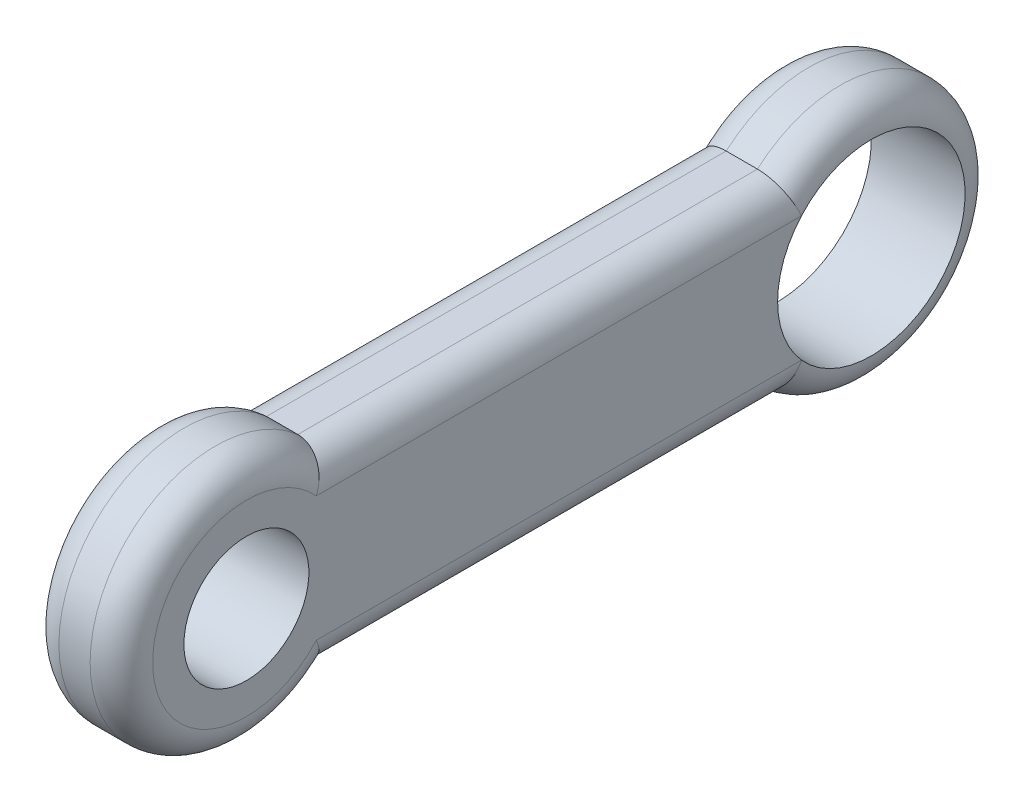
ISO-10303-21;
HEADER;
FILE_DESCRIPTION(('STEP AP214'),'2;1');
FILE_NAME('part.step','',(''),(''),'','','');
FILE_SCHEMA(('AUTOMOTIVE_DESIGN { 1 0 10303 214 1 1 1 1 }'));
ENDSEC;
DATA;
#1=APPLICATION_CONTEXT('core data for automotive mechanical design processes');
#2=APPLICATION_PROTOCOL_DEFINITION('international standard','automotive_design',2000,#1);
#3=PRODUCT_CONTEXT('',#1,'mechanical');
#4=PRODUCT('Part','Part','',(#3));
#5=PRODUCT_RELATED_PRODUCT_CATEGORY('part','',(#4));
#6=PRODUCT_DEFINITION_FORMATION('','',#4);
#7=PRODUCT_DEFINITION_CONTEXT('part definition',#1,'design');
#8=PRODUCT_DEFINITION('design','',#6,#7);
#9=PRODUCT_DEFINITION_SHAPE('','',#8);
#10=(LENGTH_UNIT() NAMED_UNIT(*) SI_UNIT(.MILLI.,.METRE.));
#11=(NAMED_UNIT(*) PLANE_ANGLE_UNIT() SI_UNIT($,.RADIAN.));
#12=(NAMED_UNIT(*) SI_UNIT($,.STERADIAN.) SOLID_ANGLE_UNIT());
#13=UNCERTAINTY_MEASURE_WITH_UNIT(LENGTH_MEASURE(1.E-05),#10,'distance_accuracy_value','');
#14=(GEOMETRIC_REPRESENTATION_CONTEXT(3) GLOBAL_UNCERTAINTY_ASSIGNED_CONTEXT((#13)) GLOBAL_UNIT_ASSIGNED_CONTEXT((#10,
#11,#12)) REPRESENTATION_CONTEXT('',''));
#15=CARTESIAN_POINT('',(0.,0.,0.));
#16=DIRECTION('',(0.,0.,1.));
#17=DIRECTION('',(1.,0.,0.));
#18=AXIS2_PLACEMENT_3D('',#15,#16,#17);
#19=CARTESIAN_POINT('',(4.5,0.,0.));
#20=DIRECTION('',(-1.,0.,0.));
#21=DIRECTION('',(0.,0.,1.));
#22=AXIS2_PLACEMENT_3D('',#19,#20,#21);
#23=CYLINDRICAL_SURFACE('',#22,6.);
#24=DIRECTION('',(-1.,0.,0.));
#25=VECTOR('',#24,1.);
#26=CARTESIAN_POINT('',(4.5,4.5,3.96862696659689));
#27=LINE('',#26,#25);
#28=CARTESIAN_POINT('',(3.,4.5,3.96862696659689));
#29=VERTEX_POINT('',#28);
#30=CARTESIAN_POINT('',(1.5,4.5,3.96862696659689));
#31=VERTEX_POINT('',#30);
#32=EDGE_CURVE('E136',#29,#31,#27,.T.);
#33=ORIENTED_EDGE('',*,*,#32,.F.);
#34=CARTESIAN_POINT('',(3.,0.,0.));
#35=DIRECTION('',(1.,0.,0.));
#36=DIRECTION('',(0.,0.,-1.));
#37=AXIS2_PLACEMENT_3D('',#34,#35,#36);
#38=CIRCLE('',#37,6.);
#39=CARTESIAN_POINT('',(3.,-4.5,3.96862696659689));
#40=VERTEX_POINT('',#39);
#41=EDGE_CURVE('E120',#29,#40,#38,.F.);
#42=ORIENTED_EDGE('',*,*,#41,.T.);
#43=DIRECTION('',(-1.,0.,0.));
#44=VECTOR('',#43,1.);
#45=CARTESIAN_POINT('',(4.5,-4.5,3.96862696659689));
#46=LINE('',#45,#44);
#47=CARTESIAN_POINT('',(1.5,-4.5,3.96862696659689));
#48=VERTEX_POINT('',#47);
#49=EDGE_CURVE('E151',#40,#48,#46,.T.);
#50=ORIENTED_EDGE('',*,*,#49,.T.);
#51=CARTESIAN_POINT('',(1.5,0.,0.));
#52=DIRECTION('',(1.,0.,0.));
#53=DIRECTION('',(0.,0.,-1.));
#54=AXIS2_PLACEMENT_3D('',#51,#52,#53);
#55=CIRCLE('',#54,6.);
#56=EDGE_CURVE('E177',#48,#31,#55,.T.);
#57=ORIENTED_EDGE('',*,*,#56,.T.);
#58=EDGE_LOOP('',(#33,#42,#50,#57));
#59=FACE_BOUND('',#58,.T.);
#60=ADVANCED_FACE('F39',(#59),#23,.T.);
#61=CARTESIAN_POINT('',(4.5,4.5,3.96862696659689));
#62=DIRECTION('',(0.,-1.,0.));
#63=DIRECTION('',(0.,0.,-1.));
#64=AXIS2_PLACEMENT_3D('',#61,#62,#63);
#65=PLANE('',#64);
#66=DIRECTION('',(-1.,0.,0.));
#67=VECTOR('',#66,1.);
#68=CARTESIAN_POINT('',(4.5,4.5,26.0313730334031));
#69=LINE('',#68,#67);
#70=CARTESIAN_POINT('',(3.,4.5,26.0313730334031));
#71=VERTEX_POINT('',#70);
#72=CARTESIAN_POINT('',(1.5,4.5,26.0313730334031));
#73=VERTEX_POINT('',#72);
#74=EDGE_CURVE('E166',#71,#73,#69,.T.);
#75=ORIENTED_EDGE('',*,*,#74,.F.);
#76=DIRECTION('',(0.,0.,1.));
#77=VECTOR('',#76,1.);
#78=CARTESIAN_POINT('',(3.,4.5,3.96862696659689));
#79=LINE('',#78,#77);
#80=EDGE_CURVE('E198',#71,#29,#79,.F.);
#81=ORIENTED_EDGE('',*,*,#80,.T.);
#82=ORIENTED_EDGE('',*,*,#32,.T.);
#83=DIRECTION('',(0.,0.,1.));
#84=VECTOR('',#83,1.);
#85=CARTESIAN_POINT('',(1.5,4.5,3.96862696659689));
#86=LINE('',#85,#84);
#87=EDGE_CURVE('E195',#31,#73,#86,.T.);
#88=ORIENTED_EDGE('',*,*,#87,.T.);
#89=EDGE_LOOP('',(#75,#81,#82,#88));
#90=FACE_BOUND('',#89,.T.);
#91=ADVANCED_FACE('F309',(#90),#65,.F.);
#92=CARTESIAN_POINT('',(4.5,0.,30.));
#93=DIRECTION('',(-1.,0.,0.));
#94=DIRECTION('',(0.,0.,1.));
#95=AXIS2_PLACEMENT_3D('',#92,#93,#94);
#96=CYLINDRICAL_SURFACE('',#95,6.);
#97=DIRECTION('',(-1.,0.,0.));
#98=VECTOR('',#97,1.);
#99=CARTESIAN_POINT('',(4.5,-4.5,26.0313730334031));
#100=LINE('',#99,#98);
#101=CARTESIAN_POINT('',(3.,-4.5,26.0313730334031));
#102=VERTEX_POINT('',#101);
#103=CARTESIAN_POINT('',(1.5,-4.5,26.0313730334031));
#104=VERTEX_POINT('',#103);
#105=EDGE_CURVE('E154',#102,#104,#100,.T.);
#106=ORIENTED_EDGE('',*,*,#105,.F.);
#107=CARTESIAN_POINT('',(3.,0.,30.));
#108=DIRECTION('',(1.,0.,0.));
#109=DIRECTION('',(0.,0.,-1.));
#110=AXIS2_PLACEMENT_3D('',#107,#108,#109);
#111=CIRCLE('',#110,6.);
#112=EDGE_CURVE('E192',#102,#71,#111,.F.);
#113=ORIENTED_EDGE('',*,*,#112,.T.);
#114=ORIENTED_EDGE('',*,*,#74,.T.);
#115=CARTESIAN_POINT('',(1.5,0.,30.));
#116=DIRECTION('',(1.,0.,0.));
#117=DIRECTION('',(0.,0.,-1.));
#118=AXIS2_PLACEMENT_3D('',#115,#116,#117);
#119=CIRCLE('',#118,6.);
#120=EDGE_CURVE('E188',#73,#104,#119,.T.);
#121=ORIENTED_EDGE('',*,*,#120,.T.);
#122=EDGE_LOOP('',(#106,#113,#114,#121));
#123=FACE_BOUND('',#122,.T.);
#124=ADVANCED_FACE('F314',(#123),#96,.T.);
#125=CARTESIAN_POINT('',(4.5,-4.5,3.96862696659689));
#126=DIRECTION('',(0.,1.,0.));
#127=DIRECTION('',(0.,0.,1.));
#128=AXIS2_PLACEMENT_3D('',#125,#126,#127);
#129=PLANE('',#128);
#130=ORIENTED_EDGE('',*,*,#49,.F.);
#131=DIRECTION('',(0.,0.,-1.));
#132=VECTOR('',#131,1.);
#133=CARTESIAN_POINT('',(3.,-4.5,26.0313730334031));
#134=LINE('',#133,#132);
#135=EDGE_CURVE('E185',#40,#102,#134,.F.);
#136=ORIENTED_EDGE('',*,*,#135,.T.);
#137=ORIENTED_EDGE('',*,*,#105,.T.);
#138=DIRECTION('',(0.,0.,-1.));
#139=VECTOR('',#138,1.);
#140=CARTESIAN_POINT('',(1.5,-4.5,3.96862696659689));
#141=LINE('',#140,#139);
#142=EDGE_CURVE('E182',#104,#48,#141,.T.);
#143=ORIENTED_EDGE('',*,*,#142,.T.);
#144=EDGE_LOOP('',(#130,#136,#137,#143));
#145=FACE_BOUND('',#144,.T.);
#146=ADVANCED_FACE('F321',(#145),#129,.F.);
#147=CARTESIAN_POINT('',(4.5,0.,0.));
#148=DIRECTION('',(1.,0.,0.));
#149=DIRECTION('',(0.,0.,-1.));
#150=AXIS2_PLACEMENT_3D('',#147,#148,#149);
#151=PLANE('',#150);
#152=CARTESIAN_POINT('',(4.5,0.,30.));
#153=DIRECTION('',(-1.,0.,0.));
#154=DIRECTION('',(0.,0.,1.));
#155=AXIS2_PLACEMENT_3D('',#152,#153,#154);
#156=CIRCLE('',#155,3.);
#157=CARTESIAN_POINT('',(4.5,0.,33.));
#158=VERTEX_POINT('',#157);
#159=EDGE_CURVE('E286',#158,#158,#156,.T.);
#160=ORIENTED_EDGE('',*,*,#159,.T.);
#161=EDGE_LOOP('',(#160));
#162=FACE_BOUND('',#161,.T.);
#163=CARTESIAN_POINT('',(4.5,0.,30.));
#164=DIRECTION('',(1.,0.,0.));
#165=DIRECTION('',(0.,0.,-1.));
#166=AXIS2_PLACEMENT_3D('',#163,#164,#165);
#167=CIRCLE('',#166,4.5);
#168=CARTESIAN_POINT('',(4.5,3.,26.6458980337503));
#169=VERTEX_POINT('',#168);
#170=CARTESIAN_POINT('',(4.5,-3.,26.6458980337503));
#171=VERTEX_POINT('',#170);
#172=EDGE_CURVE('E135',#169,#171,#167,.T.);
#173=ORIENTED_EDGE('',*,*,#172,.T.);
#174=DIRECTION('',(0.,0.,-1.));
#175=VECTOR('',#174,1.);
#176=CARTESIAN_POINT('',(4.5,-3.,3.96862696659689));
#177=LINE('',#176,#175);
#178=CARTESIAN_POINT('',(4.5,-3.,3.35410196624969));
#179=VERTEX_POINT('',#178);
#180=EDGE_CURVE('E149',#171,#179,#177,.T.);
#181=ORIENTED_EDGE('',*,*,#180,.T.);
#182=CARTESIAN_POINT('',(4.5,0.,0.));
#183=DIRECTION('',(1.,0.,0.));
#184=DIRECTION('',(0.,0.,-1.));
#185=AXIS2_PLACEMENT_3D('',#182,#183,#184);
#186=CIRCLE('',#185,4.5);
#187=CARTESIAN_POINT('',(4.5,3.,3.35410196624969));
#188=VERTEX_POINT('',#187);
#189=EDGE_CURVE('E142',#188,#179,#186,.T.);
#190=ORIENTED_EDGE('',*,*,#189,.F.);
#191=DIRECTION('',(0.,0.,1.));
#192=VECTOR('',#191,1.);
#193=CARTESIAN_POINT('',(4.5,3.,26.0313730334031));
#194=LINE('',#193,#192);
#195=EDGE_CURVE('E127',#188,#169,#194,.T.);
#196=ORIENTED_EDGE('',*,*,#195,.T.);
#197=EDGE_LOOP('',(#173,#181,#190,#196));
#198=FACE_BOUND('',#197,.T.);
#199=ADVANCED_FACE('F147',(#162,#198),#151,.T.);
#200=CARTESIAN_POINT('',(0.,0.,0.));
#201=DIRECTION('',(1.,0.,0.));
#202=DIRECTION('',(0.,0.,-1.));
#203=AXIS2_PLACEMENT_3D('',#200,#201,#202);
#204=PLANE('',#203);
#205=CARTESIAN_POINT('',(0.,0.,30.));
#206=DIRECTION('',(-1.,0.,0.));
#207=DIRECTION('',(0.,0.,1.));
#208=AXIS2_PLACEMENT_3D('',#205,#206,#207);
#209=CIRCLE('',#208,3.);
#210=CARTESIAN_POINT('',(0.,0.,33.));
#211=VERTEX_POINT('',#210);
#212=EDGE_CURVE('E158',#211,#211,#209,.T.);
#213=ORIENTED_EDGE('',*,*,#212,.F.);
#214=EDGE_LOOP('',(#213));
#215=FACE_BOUND('',#214,.T.);
#216=CARTESIAN_POINT('',(0.,0.,0.));
#217=DIRECTION('',(1.,0.,0.));
#218=DIRECTION('',(0.,0.,-1.));
#219=AXIS2_PLACEMENT_3D('',#216,#217,#218);
#220=CIRCLE('',#219,4.5);
#221=CARTESIAN_POINT('',(0.,3.,3.35410196624969));
#222=VERTEX_POINT('',#221);
#223=CARTESIAN_POINT('',(0.,-3.,3.35410196624968));
#224=VERTEX_POINT('',#223);
#225=EDGE_CURVE('E145',#222,#224,#220,.T.);
#226=ORIENTED_EDGE('',*,*,#225,.T.);
#227=DIRECTION('',(0.,0.,-1.));
#228=VECTOR('',#227,1.);
#229=CARTESIAN_POINT('',(0.,-3.,0.));
#230=LINE('',#229,#228);
#231=CARTESIAN_POINT('',(0.,-3.,26.6458980337503));
#232=VERTEX_POINT('',#231);
#233=EDGE_CURVE('E11',#224,#232,#230,.F.);
#234=ORIENTED_EDGE('',*,*,#233,.T.);
#235=CARTESIAN_POINT('',(0.,0.,30.));
#236=DIRECTION('',(1.,0.,0.));
#237=DIRECTION('',(0.,0.,-1.));
#238=AXIS2_PLACEMENT_3D('',#235,#236,#237);
#239=CIRCLE('',#238,4.5);
#240=CARTESIAN_POINT('',(0.,3.,26.6458980337503));
#241=VERTEX_POINT('',#240);
#242=EDGE_CURVE('E54',#232,#241,#239,.F.);
#243=ORIENTED_EDGE('',*,*,#242,.T.);
#244=DIRECTION('',(0.,0.,1.));
#245=VECTOR('',#244,1.);
#246=CARTESIAN_POINT('',(0.,3.,0.));
#247=LINE('',#246,#245);
#248=EDGE_CURVE('E201',#241,#222,#247,.F.);
#249=ORIENTED_EDGE('',*,*,#248,.T.);
#250=EDGE_LOOP('',(#226,#234,#243,#249));
#251=FACE_BOUND('',#250,.T.);
#252=ADVANCED_FACE('F297',(#215,#251),#204,.F.);
#253=CARTESIAN_POINT('',(4.5,0.,0.));
#254=DIRECTION('',(-1.,0.,0.));
#255=DIRECTION('',(0.,0.,1.));
#256=AXIS2_PLACEMENT_3D('',#253,#254,#255);
#257=CYLINDRICAL_SURFACE('',#256,4.5);
#258=ORIENTED_EDGE('',*,*,#189,.T.);
#259=EDGE_CURVE('E118',#179,#188,#186,.T.);
#260=ORIENTED_EDGE('',*,*,#259,.T.);
#261=EDGE_LOOP('',(#258,#260));
#262=FACE_BOUND('',#261,.T.);
#263=ORIENTED_EDGE('',*,*,#225,.F.);
#264=EDGE_CURVE('E161',#224,#222,#220,.T.);
#265=ORIENTED_EDGE('',*,*,#264,.F.);
#266=EDGE_LOOP('',(#263,#265));
#267=FACE_BOUND('',#266,.T.);
#268=ADVANCED_FACE('F140',(#262,#267),#257,.F.);
#269=CARTESIAN_POINT('',(4.5,0.,30.));
#270=DIRECTION('',(-1.,0.,0.));
#271=DIRECTION('',(0.,0.,1.));
#272=AXIS2_PLACEMENT_3D('',#269,#270,#271);
#273=CYLINDRICAL_SURFACE('',#272,3.);
#274=ORIENTED_EDGE('',*,*,#159,.F.);
#275=EDGE_LOOP('',(#274));
#276=FACE_BOUND('',#275,.T.);
#277=ORIENTED_EDGE('',*,*,#212,.T.);
#278=EDGE_LOOP('',(#277));
#279=FACE_BOUND('',#278,.T.);
#280=ADVANCED_FACE('F295',(#276,#279),#273,.F.);
#281=CARTESIAN_POINT('',(3.,0.,30.));
#282=DIRECTION('',(1.,0.,0.));
#283=DIRECTION('',(0.,0.,-1.));
#284=AXIS2_PLACEMENT_3D('',#281,#282,#283);
#285=TOROIDAL_SURFACE('',#284,4.5,1.5);
#286=CARTESIAN_POINT('',(3.,4.5,26.0313730334031));
#287=CARTESIAN_POINT('',(3.04015716624485,4.50000104423133,26.0313730936099));
#288=CARTESIAN_POINT('',(3.0802944381175,4.49838627315829,26.031982914182));
#289=CARTESIAN_POINT('',(3.16026788167873,4.49195313400506,26.0344153536942));
#290=CARTESIAN_POINT('',(3.20010410160103,4.48713529061052,26.0362377740021));
#291=CARTESIAN_POINT('',(3.31853640722141,4.46795930725867,26.0434986618104));
#292=CARTESIAN_POINT('',(3.39631585887595,4.44887830138311,26.0507308657609));
#293=CARTESIAN_POINT('',(3.54730123828659,4.39885531891844,26.0697766555324));
#294=CARTESIAN_POINT('',(3.62050754976951,4.36791433904467,26.0815898563662));
#295=CARTESIAN_POINT('',(3.76052012128351,4.29530975434962,26.1094829064321));
#296=CARTESIAN_POINT('',(3.8273248851096,4.25364365114107,26.1255637498267));
#297=CARTESIAN_POINT('',(3.954486764041,4.15989129733793,26.1620300209868));
#298=CARTESIAN_POINT('',(4.01464698622355,4.10757577654643,26.182510833247));
#299=CARTESIAN_POINT('',(4.12534467128279,3.99490744760821,26.2270412652912));
#300=CARTESIAN_POINT('',(4.17587933281925,3.93455230833832,26.2510919203991));
#301=CARTESIAN_POINT('',(4.26919776289086,3.80372859669237,26.3037964114443));
#302=CARTESIAN_POINT('',(4.31132336309023,3.73286821772903,26.3326412269157));
#303=CARTESIAN_POINT('',(4.38312826360883,3.58619600826051,26.3931312983092));
#304=CARTESIAN_POINT('',(4.41280324932809,3.51038247180344,26.4247775204297));
#305=CARTESIAN_POINT('',(4.45696209034654,3.36398414970577,26.4867662886413));
#306=CARTESIAN_POINT('',(4.47271288128486,3.29368503753875,26.5168973967216));
#307=CARTESIAN_POINT('',(4.49396769131799,3.15219210155947,26.5783750311672));
#308=CARTESIAN_POINT('',(4.49949127436012,3.08100024882451,26.6097191196212));
#309=CARTESIAN_POINT('',(4.49998884537079,3.00668762472923,26.6429082306803));
#310=CARTESIAN_POINT('',(4.50000002674718,3.00334352522558,26.6444027569459));
#311=CARTESIAN_POINT('',(4.5,3.,26.6458980337503));
#312=B_SPLINE_CURVE_WITH_KNOTS('',3,(#286,#287,#288,#289,#290,#291,#292,#293,#294,#295,#296,
#297,#298,#299,#300,#301,#302,#303,#304,#305,#306,#307,#308,#309,#310,#311),.UNSPECIFIED.,.F.,
.F.,(4,2,2,2,2,2,2,2,2,2,2,2,4),(0.,0.120395242750407,0.240770768775392,0.480752873410856,
0.720714814307178,0.960732704328357,1.20660202121853,1.4525427848282,1.7134386156302,
1.97442478199483,2.20803554017856,2.44119895346183,2.45218752952038),.UNSPECIFIED.);
#313=EDGE_CURVE('E130',#71,#169,#312,.T.);
#314=ORIENTED_EDGE('',*,*,#313,.F.);
#315=ORIENTED_EDGE('',*,*,#112,.F.);
#316=CARTESIAN_POINT('',(3.,-4.5,26.0313730334031));
#317=CARTESIAN_POINT('',(3.04015716624485,-4.50000104423134,26.0313730936099));
#318=CARTESIAN_POINT('',(3.0802944381175,-4.4983862731583,26.031982914182));
#319=CARTESIAN_POINT('',(3.16026788167873,-4.49195313400506,26.0344153536942));
#320=CARTESIAN_POINT('',(3.20010410160103,-4.48713529061053,26.0362377740021));
#321=CARTESIAN_POINT('',(3.31853640722141,-4.46795930725868,26.0434986618105));
#322=CARTESIAN_POINT('',(3.39631585887595,-4.44887830138312,26.0507308657609));
#323=CARTESIAN_POINT('',(3.54730123828659,-4.39885531891845,26.0697766555324));
#324=CARTESIAN_POINT('',(3.62050754976951,-4.36791433904468,26.0815898563662));
#325=CARTESIAN_POINT('',(3.76052012128351,-4.29530975434963,26.1094829064321));
#326=CARTESIAN_POINT('',(3.8273248851096,-4.25364365114108,26.1255637498267));
#327=CARTESIAN_POINT('',(3.954486764041,-4.15989129733794,26.1620300209868));
#328=CARTESIAN_POINT('',(4.01464698622355,-4.10757577654644,26.182510833247));
#329=CARTESIAN_POINT('',(4.12534467128279,-3.99490744760822,26.2270412652912));
#330=CARTESIAN_POINT('',(4.17587933281925,-3.93455230833833,26.2510919203992));
#331=CARTESIAN_POINT('',(4.26919776289086,-3.80372859669237,26.3037964114443));
#332=CARTESIAN_POINT('',(4.31132336309023,-3.73286821772903,26.3326412269157));
#333=CARTESIAN_POINT('',(4.38312826360883,-3.58619600826051,26.3931312983092));
#334=CARTESIAN_POINT('',(4.4128032493281,-3.51038247180345,26.4247775204297));
#335=CARTESIAN_POINT('',(4.45696209034654,-3.36398414970576,26.4867662886413));
#336=CARTESIAN_POINT('',(4.47271288128486,-3.29368503753871,26.5168973967215));
#337=CARTESIAN_POINT('',(4.49396769131799,-3.15219210155952,26.5783750311673));
#338=CARTESIAN_POINT('',(4.49949127436012,-3.08100024882468,26.6097191196215));
#339=CARTESIAN_POINT('',(4.49998884537079,-3.00668762472925,26.6429082306803));
#340=CARTESIAN_POINT('',(4.50000002674718,-3.00334352522559,26.6444027569459));
#341=CARTESIAN_POINT('',(4.5,-3.,26.6458980337503));
#342=B_SPLINE_CURVE_WITH_KNOTS('',3,(#316,#317,#318,#319,#320,#321,#322,#323,#324,#325,#326,
#327,#328,#329,#330,#331,#332,#333,#334,#335,#336,#337,#338,#339,#340,#341),.UNSPECIFIED.,.F.,
.F.,(4,2,2,2,2,2,2,2,2,2,2,2,4),(0.,0.120395242750407,0.240770768775392,0.480752873410857,
0.720714814307179,0.960732704328358,1.20660202121853,1.4525427848282,1.7134386156302,
1.97442478199483,2.20803554017856,2.44119895346183,2.45218752952038),.UNSPECIFIED.);
#343=EDGE_CURVE('E233',#171,#102,#342,.F.);
#344=ORIENTED_EDGE('',*,*,#343,.F.);
#345=ORIENTED_EDGE('',*,*,#172,.F.);
#346=EDGE_LOOP('',(#314,#315,#344,#345));
#347=FACE_BOUND('',#346,.T.);
#348=ADVANCED_FACE('F227',(#347),#285,.T.);
#349=CARTESIAN_POINT('',(3.,-3.,0.));
#350=DIRECTION('',(0.,0.,1.));
#351=DIRECTION('',(0.,-1.,0.));
#352=AXIS2_PLACEMENT_3D('',#349,#350,#351);
#353=CYLINDRICAL_SURFACE('',#352,1.5);
#354=ORIENTED_EDGE('',*,*,#343,.T.);
#355=ORIENTED_EDGE('',*,*,#135,.F.);
#356=CARTESIAN_POINT('',(3.,-4.5,3.96862696659689));
#357=CARTESIAN_POINT('',(3.04015716624485,-4.50000104423134,3.9686269063901));
#358=CARTESIAN_POINT('',(3.0802944381175,-4.49838627315829,3.96801708581803));
#359=CARTESIAN_POINT('',(3.16026788167873,-4.49195313400506,3.96558464630582));
#360=CARTESIAN_POINT('',(3.20010410160103,-4.48713529061052,3.96376222599795));
#361=CARTESIAN_POINT('',(3.31853640722141,-4.46795930725867,3.95650133818956));
#362=CARTESIAN_POINT('',(3.39631585887595,-4.44887830138312,3.94926913423906));
#363=CARTESIAN_POINT('',(3.54730123828659,-4.39885531891844,3.93022334446757));
#364=CARTESIAN_POINT('',(3.62050754976951,-4.36791433904467,3.9184101436338));
#365=CARTESIAN_POINT('',(3.76052012128351,-4.29530975434962,3.89051709356786));
#366=CARTESIAN_POINT('',(3.8273248851096,-4.25364365114107,3.87443625017329));
#367=CARTESIAN_POINT('',(3.954486764041,-4.15989129733794,3.83796997901324));
#368=CARTESIAN_POINT('',(4.01464698622355,-4.10757577654644,3.81748916675303));
#369=CARTESIAN_POINT('',(4.12534467128279,-3.99490744760822,3.77295873470878));
#370=CARTESIAN_POINT('',(4.17587933281925,-3.93455230833832,3.74890807960086));
#371=CARTESIAN_POINT('',(4.26919776289086,-3.80372859669237,3.69620358855574));
#372=CARTESIAN_POINT('',(4.31132336309023,-3.73286821772904,3.66735877308433));
#373=CARTESIAN_POINT('',(4.38312826360883,-3.58619600826051,3.60686870169082));
#374=CARTESIAN_POINT('',(4.41280324932809,-3.51038247180344,3.57522247957033));
#375=CARTESIAN_POINT('',(4.45696209034654,-3.36398414970578,3.51323371135869));
#376=CARTESIAN_POINT('',(4.47271288128486,-3.29368503753875,3.48310260327841));
#377=CARTESIAN_POINT('',(4.49396769131799,-3.15219210155946,3.42162496883285));
#378=CARTESIAN_POINT('',(4.49949127436012,-3.0810002488245,3.39028088037888));
#379=CARTESIAN_POINT('',(4.49998884537079,-3.00668762472923,3.35709176931974));
#380=CARTESIAN_POINT('',(4.50000002674718,-3.00334352522558,3.35559724305414));
#381=CARTESIAN_POINT('',(4.5,-3.,3.35410196624968));
#382=B_SPLINE_CURVE_WITH_KNOTS('',3,(#356,#357,#358,#359,#360,#361,#362,#363,#364,#365,#366,
#367,#368,#369,#370,#371,#372,#373,#374,#375,#376,#377,#378,#379,#380,#381),.UNSPECIFIED.,.F.,
.F.,(4,2,2,2,2,2,2,2,2,2,2,2,4),(0.,0.120395242750406,0.240770768775391,0.480752873410856,
0.720714814307179,0.960732704328358,1.20660202121853,1.4525427848282,1.7134386156302,
1.97442478199483,2.20803554017856,2.44119895346183,2.45218752952038),.UNSPECIFIED.);
#383=EDGE_CURVE('E124',#179,#40,#382,.F.);
#384=ORIENTED_EDGE('',*,*,#383,.F.);
#385=ORIENTED_EDGE('',*,*,#180,.F.);
#386=EDGE_LOOP('',(#354,#355,#384,#385));
#387=FACE_BOUND('',#386,.T.);
#388=ADVANCED_FACE('F222',(#387),#353,.T.);
#389=CARTESIAN_POINT('',(3.,3.,0.));
#390=DIRECTION('',(0.,0.,-1.));
#391=DIRECTION('',(0.,1.,0.));
#392=AXIS2_PLACEMENT_3D('',#389,#390,#391);
#393=CYLINDRICAL_SURFACE('',#392,1.5);
#394=ORIENTED_EDGE('',*,*,#313,.T.);
#395=ORIENTED_EDGE('',*,*,#195,.F.);
#396=CARTESIAN_POINT('',(3.,4.5,3.96862696659689));
#397=CARTESIAN_POINT('',(3.04015716624485,4.50000104423134,3.9686269063901));
#398=CARTESIAN_POINT('',(3.0802944381175,4.49838627315829,3.96801708581803));
#399=CARTESIAN_POINT('',(3.16026788167873,4.49195313400506,3.96558464630582));
#400=CARTESIAN_POINT('',(3.20010410160103,4.48713529061052,3.96376222599795));
#401=CARTESIAN_POINT('',(3.31853640722141,4.46795930725867,3.95650133818956));
#402=CARTESIAN_POINT('',(3.39631585887595,4.44887830138311,3.94926913423906));
#403=CARTESIAN_POINT('',(3.54730123828659,4.39885531891844,3.93022334446757));
#404=CARTESIAN_POINT('',(3.62050754976951,4.36791433904467,3.9184101436338));
#405=CARTESIAN_POINT('',(3.76052012128351,4.29530975434962,3.89051709356786));
#406=CARTESIAN_POINT('',(3.8273248851096,4.25364365114107,3.87443625017329));
#407=CARTESIAN_POINT('',(3.954486764041,4.15989129733794,3.83796997901324));
#408=CARTESIAN_POINT('',(4.01464698622355,4.10757577654644,3.81748916675303));
#409=CARTESIAN_POINT('',(4.12534467128279,3.99490744760822,3.77295873470878));
#410=CARTESIAN_POINT('',(4.17587933281925,3.93455230833832,3.74890807960086));
#411=CARTESIAN_POINT('',(4.26919776289086,3.80372859669237,3.69620358855575));
#412=CARTESIAN_POINT('',(4.31132336309023,3.73286821772903,3.66735877308433));
#413=CARTESIAN_POINT('',(4.38312826360883,3.58619600826051,3.60686870169081));
#414=CARTESIAN_POINT('',(4.41280324932809,3.51038247180345,3.57522247957031));
#415=CARTESIAN_POINT('',(4.45696209034654,3.36398414970577,3.51323371135871));
#416=CARTESIAN_POINT('',(4.47271288128486,3.29368503753873,3.48310260327847));
#417=CARTESIAN_POINT('',(4.49396769131799,3.15219210155949,3.42162496883279));
#418=CARTESIAN_POINT('',(4.49949127436012,3.08100024882459,3.39028088037867));
#419=CARTESIAN_POINT('',(4.49998884537079,3.00668762472924,3.35709176931972));
#420=CARTESIAN_POINT('',(4.50000002674718,3.00334352522558,3.35559724305413));
#421=CARTESIAN_POINT('',(4.5,3.,3.35410196624968));
#422=B_SPLINE_CURVE_WITH_KNOTS('',3,(#396,#397,#398,#399,#400,#401,#402,#403,#404,#405,#406,
#407,#408,#409,#410,#411,#412,#413,#414,#415,#416,#417,#418,#419,#420,#421),.UNSPECIFIED.,.F.,
.F.,(4,2,2,2,2,2,2,2,2,2,2,2,4),(0.,0.120395242750406,0.240770768775391,0.480752873410856,
0.720714814307179,0.960732704328358,1.20660202121853,1.4525427848282,1.7134386156302,
1.97442478199483,2.20803554017856,2.44119895346183,2.45218752952038),.UNSPECIFIED.);
#423=EDGE_CURVE('E114',#29,#188,#422,.T.);
#424=ORIENTED_EDGE('',*,*,#423,.F.);
#425=ORIENTED_EDGE('',*,*,#80,.F.);
#426=EDGE_LOOP('',(#394,#395,#424,#425));
#427=FACE_BOUND('',#426,.T.);
#428=ADVANCED_FACE('F128',(#427),#393,.T.);
#429=CARTESIAN_POINT('',(3.,0.,0.));
#430=DIRECTION('',(1.,0.,0.));
#431=DIRECTION('',(0.,0.,-1.));
#432=AXIS2_PLACEMENT_3D('',#429,#430,#431);
#433=TOROIDAL_SURFACE('',#432,4.5,1.5);
#434=ORIENTED_EDGE('',*,*,#383,.T.);
#435=ORIENTED_EDGE('',*,*,#41,.F.);
#436=ORIENTED_EDGE('',*,*,#423,.T.);
#437=ORIENTED_EDGE('',*,*,#259,.F.);
#438=EDGE_LOOP('',(#434,#435,#436,#437));
#439=FACE_BOUND('',#438,.T.);
#440=ADVANCED_FACE('F116',(#439),#433,.T.);
#441=CARTESIAN_POINT('',(1.5,0.,0.));
#442=DIRECTION('',(1.,0.,0.));
#443=DIRECTION('',(0.,0.,-1.));
#444=AXIS2_PLACEMENT_3D('',#441,#442,#443);
#445=TOROIDAL_SURFACE('',#444,4.5,1.5);
#446=CARTESIAN_POINT('',(1.5,-4.5,3.96862696659689));
#447=CARTESIAN_POINT('',(1.45984283375515,-4.50000104423134,3.9686269063901));
#448=CARTESIAN_POINT('',(1.4197055618825,-4.49838627315829,3.96801708581803));
#449=CARTESIAN_POINT('',(1.33973211832127,-4.49195313400506,3.96558464630582));
#450=CARTESIAN_POINT('',(1.29989589839897,-4.48713529061052,3.96376222599795));
#451=CARTESIAN_POINT('',(1.18146359277859,-4.46795930725867,3.95650133818956));
#452=CARTESIAN_POINT('',(1.10368414112405,-4.44887830138312,3.94926913423906));
#453=CARTESIAN_POINT('',(0.952698761713406,-4.39885531891844,3.93022334446757));
#454=CARTESIAN_POINT('',(0.879492450230491,-4.36791433904468,3.9184101436338));
#455=CARTESIAN_POINT('',(0.739479878716492,-4.29530975434962,3.89051709356786));
#456=CARTESIAN_POINT('',(0.672675114890402,-4.25364365114108,3.87443625017329));
#457=CARTESIAN_POINT('',(0.545513235958998,-4.15989129733794,3.83796997901324));
#458=CARTESIAN_POINT('',(0.485353013776447,-4.10757577654644,3.81748916675303));
#459=CARTESIAN_POINT('',(0.374655328717214,-3.99490744760822,3.77295873470878));
#460=CARTESIAN_POINT('',(0.324120667180752,-3.93455230833832,3.74890807960086));
#461=CARTESIAN_POINT('',(0.230802237109144,-3.80372859669237,3.69620358855574));
#462=CARTESIAN_POINT('',(0.188676636909769,-3.73286821772904,3.66735877308433));
#463=CARTESIAN_POINT('',(0.116871736391169,-3.58619600826051,3.60686870169081));
#464=CARTESIAN_POINT('',(0.0871967506719055,-3.51038247180345,3.5752224795703));
#465=CARTESIAN_POINT('',(0.0430379096534632,-3.36398414970577,3.51323371135871));
#466=CARTESIAN_POINT('',(0.0272871187151456,-3.29368503753872,3.48310260327848));
#467=CARTESIAN_POINT('',(0.00603230868201046,-3.15219210155949,3.42162496883278));
#468=CARTESIAN_POINT('',(0.0005087256398766,-3.0810002488246,3.39028088037864));
#469=CARTESIAN_POINT('',(1.11546292071394E-05,-3.00668762472924,3.35709176931972));
#470=CARTESIAN_POINT('',(-2.67471778700641E-08,-3.00334352522559,3.35559724305413));
#471=CARTESIAN_POINT('',(0.,-3.,3.35410196624968));
#472=B_SPLINE_CURVE_WITH_KNOTS('',3,(#446,#447,#448,#449,#450,#451,#452,#453,#454,#455,#456,
#457,#458,#459,#460,#461,#462,#463,#464,#465,#466,#467,#468,#469,#470,#471),.UNSPECIFIED.,.F.,
.F.,(4,2,2,2,2,2,2,2,2,2,2,2,4),(0.,0.120395242750406,0.240770768775392,0.480752873410856,
0.720714814307178,0.960732704328357,1.20660202121853,1.4525427848282,1.7134386156302,
1.97442478199483,2.20803554017856,2.44119895346183,2.45218752952038),.UNSPECIFIED.);
#473=EDGE_CURVE('E266',#224,#48,#472,.F.);
#474=ORIENTED_EDGE('',*,*,#473,.F.);
#475=ORIENTED_EDGE('',*,*,#264,.T.);
#476=CARTESIAN_POINT('',(1.5,4.5,3.96862696659689));
#477=CARTESIAN_POINT('',(1.45984283375515,4.50000104423134,3.9686269063901));
#478=CARTESIAN_POINT('',(1.4197055618825,4.49838627315829,3.96801708581803));
#479=CARTESIAN_POINT('',(1.33973211832127,4.49195313400506,3.96558464630582));
#480=CARTESIAN_POINT('',(1.29989589839897,4.48713529061052,3.96376222599795));
#481=CARTESIAN_POINT('',(1.18146359277859,4.46795930725867,3.95650133818956));
#482=CARTESIAN_POINT('',(1.10368414112405,4.44887830138311,3.94926913423906));
#483=CARTESIAN_POINT('',(0.952698761713406,4.39885531891844,3.93022334446757));
#484=CARTESIAN_POINT('',(0.87949245023049,4.36791433904467,3.9184101436338));
#485=CARTESIAN_POINT('',(0.739479878716491,4.29530975434962,3.89051709356786));
#486=CARTESIAN_POINT('',(0.672675114890402,4.25364365114107,3.87443625017329));
#487=CARTESIAN_POINT('',(0.545513235958999,4.15989129733794,3.83796997901324));
#488=CARTESIAN_POINT('',(0.485353013776447,4.10757577654644,3.81748916675303));
#489=CARTESIAN_POINT('',(0.374655328717215,3.99490744760822,3.77295873470878));
#490=CARTESIAN_POINT('',(0.324120667180752,3.93455230833832,3.74890807960085));
#491=CARTESIAN_POINT('',(0.230802237109144,3.80372859669237,3.69620358855575));
#492=CARTESIAN_POINT('',(0.188676636909768,3.73286821772903,3.66735877308434));
#493=CARTESIAN_POINT('',(0.116871736391168,3.58619600826051,3.6068687016908));
#494=CARTESIAN_POINT('',(0.087196750671905,3.51038247180346,3.57522247957027));
#495=CARTESIAN_POINT('',(0.0430379096534633,3.36398414970575,3.51323371135874));
#496=CARTESIAN_POINT('',(0.0272871187151458,3.29368503753868,3.4831026032786));
#497=CARTESIAN_POINT('',(0.00603230868201097,3.15219210155955,3.42162496883266));
#498=CARTESIAN_POINT('',(0.00050872563987778,3.0810002488248,3.39028088037821));
#499=CARTESIAN_POINT('',(1.11546292072482E-05,3.00668762472925,3.35709176931968));
#500=CARTESIAN_POINT('',(-2.67471778132446E-08,3.00334352522559,3.35559724305411));
#501=CARTESIAN_POINT('',(0.,3.,3.35410196624968));
#502=B_SPLINE_CURVE_WITH_KNOTS('',3,(#476,#477,#478,#479,#480,#481,#482,#483,#484,#485,#486,
#487,#488,#489,#490,#491,#492,#493,#494,#495,#496,#497,#498,#499,#500,#501),.UNSPECIFIED.,.F.,
.F.,(4,2,2,2,2,2,2,2,2,2,2,2,4),(0.,0.120395242750407,0.240770768775392,0.480752873410856,
0.720714814307179,0.960732704328357,1.20660202121853,1.4525427848282,1.71343861563021,
1.97442478199483,2.20803554017855,2.44119895346183,2.45218752952038),.UNSPECIFIED.);
#503=EDGE_CURVE('E44',#31,#222,#502,.T.);
#504=ORIENTED_EDGE('',*,*,#503,.F.);
#505=ORIENTED_EDGE('',*,*,#56,.F.);
#506=EDGE_LOOP('',(#474,#475,#504,#505));
#507=FACE_BOUND('',#506,.T.);
#508=ADVANCED_FACE('F41',(#507),#445,.T.);
#509=CARTESIAN_POINT('',(1.5,3.,3.96862696659689));
#510=DIRECTION('',(0.,0.,1.));
#511=DIRECTION('',(0.,-1.,0.));
#512=AXIS2_PLACEMENT_3D('',#509,#510,#511);
#513=CYLINDRICAL_SURFACE('',#512,1.5);
#514=ORIENTED_EDGE('',*,*,#503,.T.);
#515=ORIENTED_EDGE('',*,*,#248,.F.);
#516=CARTESIAN_POINT('',(1.5,4.5,26.0313730334031));
#517=CARTESIAN_POINT('',(1.45984283375515,4.50000104423133,26.0313730936099));
#518=CARTESIAN_POINT('',(1.4197055618825,4.49838627315829,26.031982914182));
#519=CARTESIAN_POINT('',(1.33973211832127,4.49195313400506,26.0344153536942));
#520=CARTESIAN_POINT('',(1.29989589839897,4.48713529061052,26.036237774002));
#521=CARTESIAN_POINT('',(1.18146359277859,4.46795930725867,26.0434986618104));
#522=CARTESIAN_POINT('',(1.10368414112405,4.44887830138311,26.0507308657609));
#523=CARTESIAN_POINT('',(0.952698761713406,4.39885531891844,26.0697766555324));
#524=CARTESIAN_POINT('',(0.879492450230491,4.36791433904467,26.0815898563662));
#525=CARTESIAN_POINT('',(0.739479878716492,4.29530975434962,26.1094829064321));
#526=CARTESIAN_POINT('',(0.672675114890402,4.25364365114107,26.1255637498267));
#527=CARTESIAN_POINT('',(0.545513235958998,4.15989129733793,26.1620300209868));
#528=CARTESIAN_POINT('',(0.485353013776445,4.10757577654643,26.182510833247));
#529=CARTESIAN_POINT('',(0.374655328717213,3.99490744760821,26.2270412652912));
#530=CARTESIAN_POINT('',(0.324120667180751,3.93455230833832,26.2510919203991));
#531=CARTESIAN_POINT('',(0.230802237109144,3.80372859669237,26.3037964114443));
#532=CARTESIAN_POINT('',(0.188676636909769,3.73286821772903,26.3326412269157));
#533=CARTESIAN_POINT('',(0.116871736391169,3.5861960082605,26.3931312983092));
#534=CARTESIAN_POINT('',(0.0871967506719053,3.51038247180344,26.4247775204297));
#535=CARTESIAN_POINT('',(0.043037909653463,3.36398414970577,26.4867662886413));
#536=CARTESIAN_POINT('',(0.0272871187151451,3.29368503753874,26.5168973967216));
#537=CARTESIAN_POINT('',(0.00603230868201106,3.15219210155947,26.5783750311672));
#538=CARTESIAN_POINT('',(0.000508725639878543,3.08100024882452,26.6097191196212));
#539=CARTESIAN_POINT('',(1.11546292073169E-05,3.00668762472923,26.6429082306803));
#540=CARTESIAN_POINT('',(-2.67471777787135E-08,3.00334352522558,26.6444027569459));
#541=CARTESIAN_POINT('',(0.,3.,26.6458980337503));
#542=B_SPLINE_CURVE_WITH_KNOTS('',3,(#516,#517,#518,#519,#520,#521,#522,#523,#524,#525,#526,
#527,#528,#529,#530,#531,#532,#533,#534,#535,#536,#537,#538,#539,#540,#541),.UNSPECIFIED.,.F.,
.F.,(4,2,2,2,2,2,2,2,2,2,2,2,4),(0.,0.120395242750406,0.240770768775392,0.480752873410856,
0.720714814307178,0.960732704328357,1.20660202121853,1.45254278482821,1.7134386156302,
1.97442478199483,2.20803554017856,2.44119895346183,2.45218752952038),.UNSPECIFIED.);
#543=EDGE_CURVE('E67',#73,#241,#542,.T.);
#544=ORIENTED_EDGE('',*,*,#543,.F.);
#545=ORIENTED_EDGE('',*,*,#87,.F.);
#546=EDGE_LOOP('',(#514,#515,#544,#545));
#547=FACE_BOUND('',#546,.T.);
#548=ADVANCED_FACE('F262',(#547),#513,.T.);
#549=CARTESIAN_POINT('',(1.5,-3.,3.96862696659689));
#550=DIRECTION('',(0.,0.,-1.));
#551=DIRECTION('',(0.,1.,0.));
#552=AXIS2_PLACEMENT_3D('',#549,#550,#551);
#553=CYLINDRICAL_SURFACE('',#552,1.5);
#554=ORIENTED_EDGE('',*,*,#473,.T.);
#555=ORIENTED_EDGE('',*,*,#142,.F.);
#556=CARTESIAN_POINT('',(1.5,-4.5,26.0313730334031));
#557=CARTESIAN_POINT('',(1.45984283375515,-4.50000104423134,26.0313730936099));
#558=CARTESIAN_POINT('',(1.4197055618825,-4.4983862731583,26.031982914182));
#559=CARTESIAN_POINT('',(1.33973211832127,-4.49195313400506,26.0344153536942));
#560=CARTESIAN_POINT('',(1.29989589839897,-4.48713529061053,26.0362377740021));
#561=CARTESIAN_POINT('',(1.18146359277859,-4.46795930725868,26.0434986618105));
#562=CARTESIAN_POINT('',(1.10368414112405,-4.44887830138312,26.050730865761));
#563=CARTESIAN_POINT('',(0.952698761713406,-4.39885531891845,26.0697766555324));
#564=CARTESIAN_POINT('',(0.87949245023049,-4.36791433904468,26.0815898563662));
#565=CARTESIAN_POINT('',(0.739479878716491,-4.29530975434963,26.1094829064321));
#566=CARTESIAN_POINT('',(0.672675114890401,-4.25364365114108,26.1255637498267));
#567=CARTESIAN_POINT('',(0.545513235958998,-4.15989129733794,26.1620300209868));
#568=CARTESIAN_POINT('',(0.485353013776446,-4.10757577654644,26.182510833247));
#569=CARTESIAN_POINT('',(0.374655328717213,-3.99490744760822,26.2270412652912));
#570=CARTESIAN_POINT('',(0.324120667180751,-3.93455230833832,26.2510919203992));
#571=CARTESIAN_POINT('',(0.230802237109143,-3.80372859669237,26.3037964114443));
#572=CARTESIAN_POINT('',(0.188676636909767,-3.73286821772903,26.3326412269157));
#573=CARTESIAN_POINT('',(0.116871736391167,-3.58619600826051,26.3931312983092));
#574=CARTESIAN_POINT('',(0.0871967506719044,-3.51038247180345,26.4247775204297));
#575=CARTESIAN_POINT('',(0.0430379096534627,-3.36398414970576,26.4867662886413));
#576=CARTESIAN_POINT('',(0.027287118715145,-3.29368503753871,26.5168973967215));
#577=CARTESIAN_POINT('',(0.0060323086820107,-3.15219210155951,26.5783750311673));
#578=CARTESIAN_POINT('',(0.000508725639877814,-3.08100024882468,26.6097191196215));
#579=CARTESIAN_POINT('',(1.11546292072551E-05,-3.00668762472925,26.6429082306803));
#580=CARTESIAN_POINT('',(-2.67471778083957E-08,-3.00334352522559,26.6444027569459));
#581=CARTESIAN_POINT('',(0.,-3.,26.6458980337503));
#582=B_SPLINE_CURVE_WITH_KNOTS('',3,(#556,#557,#558,#559,#560,#561,#562,#563,#564,#565,#566,
#567,#568,#569,#570,#571,#572,#573,#574,#575,#576,#577,#578,#579,#580,#581),.UNSPECIFIED.,.F.,
.F.,(4,2,2,2,2,2,2,2,2,2,2,2,4),(0.,0.120395242750407,0.240770768775392,0.480752873410857,
0.720714814307179,0.960732704328358,1.20660202121853,1.45254278482821,1.71343861563021,
1.97442478199483,2.20803554017856,2.44119895346183,2.45218752952038),.UNSPECIFIED.);
#583=EDGE_CURVE('E245',#232,#104,#582,.F.);
#584=ORIENTED_EDGE('',*,*,#583,.F.);
#585=ORIENTED_EDGE('',*,*,#233,.F.);
#586=EDGE_LOOP('',(#554,#555,#584,#585));
#587=FACE_BOUND('',#586,.T.);
#588=ADVANCED_FACE('F259',(#587),#553,.T.);
#589=CARTESIAN_POINT('',(1.5,0.,30.));
#590=DIRECTION('',(1.,0.,0.));
#591=DIRECTION('',(0.,0.,-1.));
#592=AXIS2_PLACEMENT_3D('',#589,#590,#591);
#593=TOROIDAL_SURFACE('',#592,4.5,1.5);
#594=ORIENTED_EDGE('',*,*,#543,.T.);
#595=ORIENTED_EDGE('',*,*,#242,.F.);
#596=ORIENTED_EDGE('',*,*,#583,.T.);
#597=ORIENTED_EDGE('',*,*,#120,.F.);
#598=EDGE_LOOP('',(#594,#595,#596,#597));
#599=FACE_BOUND('',#598,.T.);
#600=ADVANCED_FACE('F257',(#599),#593,.T.);
#601=CLOSED_SHELL('',(#60,#91,#124,#146,#199,#252,#268,#280,#348,#388,#428,#440,#508,#548,#588,#600));
#602=MANIFOLD_SOLID_BREP('B2',#601);
#603=ADVANCED_BREP_SHAPE_REPRESENTATION('',(#18,#602),#14);
#604=SHAPE_DEFINITION_REPRESENTATION(#9,#603);
ENDSEC;
END-ISO-10303-21;
